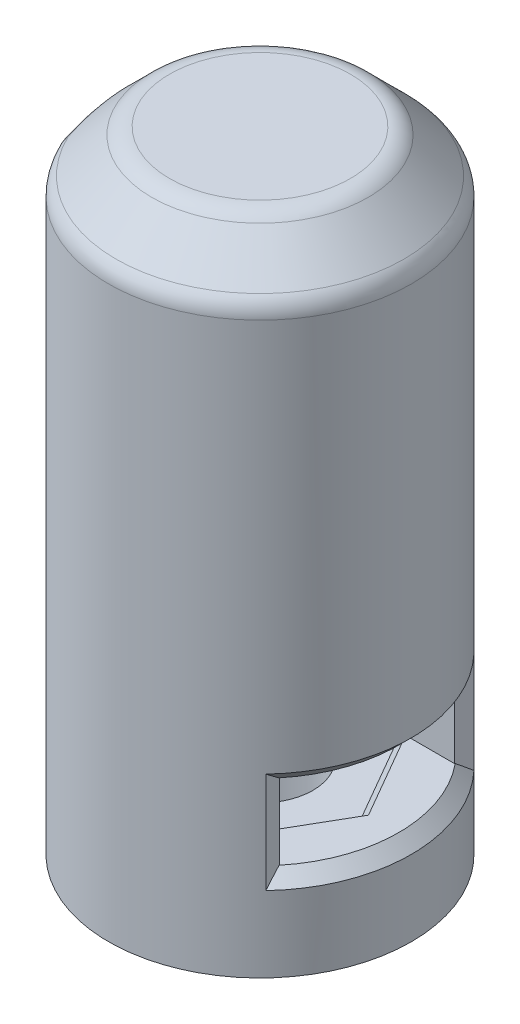
ISO-10303-21;
HEADER;
FILE_DESCRIPTION(('STEP AP214'),'2;1');
FILE_NAME('part.step','',(''),(''),'','','');
FILE_SCHEMA(('AUTOMOTIVE_DESIGN { 1 0 10303 214 1 1 1 1 }'));
ENDSEC;
DATA;
#1=APPLICATION_CONTEXT('core data for automotive mechanical design processes');
#2=APPLICATION_PROTOCOL_DEFINITION('international standard','automotive_design',2000,#1);
#3=PRODUCT_CONTEXT('',#1,'mechanical');
#4=PRODUCT('Part','Part','',(#3));
#5=PRODUCT_RELATED_PRODUCT_CATEGORY('part','',(#4));
#6=PRODUCT_DEFINITION_FORMATION('','',#4);
#7=PRODUCT_DEFINITION_CONTEXT('part definition',#1,'design');
#8=PRODUCT_DEFINITION('design','',#6,#7);
#9=PRODUCT_DEFINITION_SHAPE('','',#8);
#10=(LENGTH_UNIT() NAMED_UNIT(*) SI_UNIT(.MILLI.,.METRE.));
#11=(NAMED_UNIT(*) PLANE_ANGLE_UNIT() SI_UNIT($,.RADIAN.));
#12=(NAMED_UNIT(*) SI_UNIT($,.STERADIAN.) SOLID_ANGLE_UNIT());
#13=UNCERTAINTY_MEASURE_WITH_UNIT(LENGTH_MEASURE(1.E-05),#10,'distance_accuracy_value','');
#14=(GEOMETRIC_REPRESENTATION_CONTEXT(3) GLOBAL_UNCERTAINTY_ASSIGNED_CONTEXT((#13)) GLOBAL_UNIT_ASSIGNED_CONTEXT((#10,
#11,#12)) REPRESENTATION_CONTEXT('',''));
#15=CARTESIAN_POINT('',(0.,0.,0.));
#16=DIRECTION('',(0.,0.,1.));
#17=DIRECTION('',(1.,0.,0.));
#18=AXIS2_PLACEMENT_3D('',#15,#16,#17);
#19=CARTESIAN_POINT('',(-2.00629218543395,-9.25,3.475));
#20=DIRECTION('',(0.,0.,1.));
#21=DIRECTION('',(1.,0.,0.));
#22=AXIS2_PLACEMENT_3D('',#19,#20,#21);
#23=PLANE('',#22);
#24=DIRECTION('',(1.,0.,0.));
#25=VECTOR('',#24,1.);
#26=CARTESIAN_POINT('',(-2.00629218543395,-6.,3.475));
#27=LINE('',#26,#25);
#28=CARTESIAN_POINT('',(-2.00629218543395,-6.,3.475));
#29=VERTEX_POINT('',#28);
#30=CARTESIAN_POINT('',(4.24580486280105,-6.,3.475));
#31=VERTEX_POINT('',#30);
#32=EDGE_CURVE('E204',#29,#31,#27,.T.);
#33=ORIENTED_EDGE('',*,*,#32,.T.);
#34=DIRECTION('',(0.,-1.,0.));
#35=VECTOR('',#34,1.);
#36=CARTESIAN_POINT('',(4.24580486280105,-9.25,3.475));
#37=LINE('',#36,#35);
#38=CARTESIAN_POINT('',(4.24580486280105,-9.,3.475));
#39=VERTEX_POINT('',#38);
#40=EDGE_CURVE('E422',#31,#39,#37,.T.);
#41=ORIENTED_EDGE('',*,*,#40,.T.);
#42=DIRECTION('',(-1.,0.,0.));
#43=VECTOR('',#42,1.);
#44=CARTESIAN_POINT('',(6.,-9.,3.475));
#45=LINE('',#44,#43);
#46=CARTESIAN_POINT('',(2.29496732002876,-9.,3.475));
#47=VERTEX_POINT('',#46);
#48=EDGE_CURVE('E169',#39,#47,#45,.T.);
#49=ORIENTED_EDGE('',*,*,#48,.T.);
#50=DIRECTION('',(-0.755928946018456,-0.654653670707976,0.));
#51=VECTOR('',#50,1.);
#52=CARTESIAN_POINT('',(-0.286613169347715,-11.2357142857143,3.475));
#53=LINE('',#52,#51);
#54=CARTESIAN_POINT('',(2.00629218543395,-9.25,3.475));
#55=VERTEX_POINT('',#54);
#56=EDGE_CURVE('E162',#47,#55,#53,.T.);
#57=ORIENTED_EDGE('',*,*,#56,.T.);
#58=DIRECTION('',(1.,0.,0.));
#59=VECTOR('',#58,1.);
#60=CARTESIAN_POINT('',(-2.00629218543395,-9.25,3.475));
#61=LINE('',#60,#59);
#62=CARTESIAN_POINT('',(-2.00629218543395,-9.25,3.475));
#63=VERTEX_POINT('',#62);
#64=EDGE_CURVE('E164',#63,#55,#61,.T.);
#65=ORIENTED_EDGE('',*,*,#64,.F.);
#66=DIRECTION('',(0.,1.,0.));
#67=VECTOR('',#66,1.);
#68=CARTESIAN_POINT('',(-2.00629218543395,-9.25,3.475));
#69=LINE('',#68,#67);
#70=EDGE_CURVE('E214',#63,#29,#69,.T.);
#71=ORIENTED_EDGE('',*,*,#70,.T.);
#72=EDGE_LOOP('',(#33,#41,#49,#57,#65,#71));
#73=FACE_BOUND('',#72,.T.);
#74=ADVANCED_FACE('F41',(#73),#23,.F.);
#75=CARTESIAN_POINT('',(-4.0125843708679,-9.25,0.));
#76=DIRECTION('',(-0.866025403784438,0.,0.5));
#77=DIRECTION('',(0.5,0.,0.866025403784439));
#78=AXIS2_PLACEMENT_3D('',#75,#76,#77);
#79=PLANE('',#78);
#80=DIRECTION('',(0.5,0.,0.866025403784438));
#81=VECTOR('',#80,1.);
#82=CARTESIAN_POINT('',(-4.0125843708679,-6.,0.));
#83=LINE('',#82,#81);
#84=CARTESIAN_POINT('',(-4.0125843708679,-6.,0.));
#85=VERTEX_POINT('',#84);
#86=EDGE_CURVE('E184',#85,#29,#83,.T.);
#87=ORIENTED_EDGE('',*,*,#86,.T.);
#88=ORIENTED_EDGE('',*,*,#70,.F.);
#89=DIRECTION('',(0.5,0.,0.866025403784438));
#90=VECTOR('',#89,1.);
#91=CARTESIAN_POINT('',(-4.0125843708679,-9.25,0.));
#92=LINE('',#91,#90);
#93=CARTESIAN_POINT('',(-4.0125843708679,-9.25,0.));
#94=VERTEX_POINT('',#93);
#95=EDGE_CURVE('E183',#94,#63,#92,.T.);
#96=ORIENTED_EDGE('',*,*,#95,.F.);
#97=DIRECTION('',(0.,1.,0.));
#98=VECTOR('',#97,1.);
#99=CARTESIAN_POINT('',(-4.0125843708679,-9.25,0.));
#100=LINE('',#99,#98);
#101=EDGE_CURVE('E211',#94,#85,#100,.T.);
#102=ORIENTED_EDGE('',*,*,#101,.T.);
#103=EDGE_LOOP('',(#87,#88,#96,#102));
#104=FACE_BOUND('',#103,.T.);
#105=ADVANCED_FACE('F348',(#104),#79,.F.);
#106=CARTESIAN_POINT('',(-2.00629218543395,-9.25,-3.475));
#107=DIRECTION('',(-0.866025403784438,0.,-0.5));
#108=DIRECTION('',(-0.5,0.,0.866025403784439));
#109=AXIS2_PLACEMENT_3D('',#106,#107,#108);
#110=PLANE('',#109);
#111=DIRECTION('',(-0.5,0.,0.866025403784439));
#112=VECTOR('',#111,1.);
#113=CARTESIAN_POINT('',(-2.00629218543395,-6.,-3.475));
#114=LINE('',#113,#112);
#115=CARTESIAN_POINT('',(-2.00629218543395,-6.,-3.475));
#116=VERTEX_POINT('',#115);
#117=EDGE_CURVE('E210',#116,#85,#114,.T.);
#118=ORIENTED_EDGE('',*,*,#117,.T.);
#119=ORIENTED_EDGE('',*,*,#101,.F.);
#120=DIRECTION('',(-0.5,0.,0.866025403784439));
#121=VECTOR('',#120,1.);
#122=CARTESIAN_POINT('',(-2.00629218543395,-9.25,-3.475));
#123=LINE('',#122,#121);
#124=CARTESIAN_POINT('',(-2.00629218543395,-9.25,-3.475));
#125=VERTEX_POINT('',#124);
#126=EDGE_CURVE('E198',#125,#94,#123,.T.);
#127=ORIENTED_EDGE('',*,*,#126,.F.);
#128=DIRECTION('',(0.,1.,0.));
#129=VECTOR('',#128,1.);
#130=CARTESIAN_POINT('',(-2.00629218543395,-9.25,-3.475));
#131=LINE('',#130,#129);
#132=EDGE_CURVE('E202',#125,#116,#131,.T.);
#133=ORIENTED_EDGE('',*,*,#132,.T.);
#134=EDGE_LOOP('',(#118,#119,#127,#133));
#135=FACE_BOUND('',#134,.T.);
#136=ADVANCED_FACE('F353',(#135),#110,.F.);
#137=CARTESIAN_POINT('',(2.00629218543395,-9.25,-3.475));
#138=DIRECTION('',(0.,0.,-1.));
#139=DIRECTION('',(-1.,0.,0.));
#140=AXIS2_PLACEMENT_3D('',#137,#138,#139);
#141=PLANE('',#140);
#142=DIRECTION('',(-1.,0.,0.));
#143=VECTOR('',#142,1.);
#144=CARTESIAN_POINT('',(6.,-9.,-3.475));
#145=LINE('',#144,#143);
#146=CARTESIAN_POINT('',(4.24580486280106,-9.,-3.475));
#147=VERTEX_POINT('',#146);
#148=CARTESIAN_POINT('',(2.29496732002876,-9.,-3.475));
#149=VERTEX_POINT('',#148);
#150=EDGE_CURVE('E402',#147,#149,#145,.T.);
#151=ORIENTED_EDGE('',*,*,#150,.F.);
#152=DIRECTION('',(0.,1.,0.));
#153=VECTOR('',#152,1.);
#154=CARTESIAN_POINT('',(4.24580486280106,-9.25,-3.475));
#155=LINE('',#154,#153);
#156=CARTESIAN_POINT('',(4.24580486280106,-6.,-3.475));
#157=VERTEX_POINT('',#156);
#158=EDGE_CURVE('E412',#147,#157,#155,.T.);
#159=ORIENTED_EDGE('',*,*,#158,.T.);
#160=DIRECTION('',(-1.,0.,0.));
#161=VECTOR('',#160,1.);
#162=CARTESIAN_POINT('',(2.00629218543395,-6.,-3.475));
#163=LINE('',#162,#161);
#164=EDGE_CURVE('E205',#157,#116,#163,.T.);
#165=ORIENTED_EDGE('',*,*,#164,.T.);
#166=ORIENTED_EDGE('',*,*,#132,.F.);
#167=DIRECTION('',(-1.,0.,0.));
#168=VECTOR('',#167,1.);
#169=CARTESIAN_POINT('',(2.00629218543395,-9.25,-3.475));
#170=LINE('',#169,#168);
#171=CARTESIAN_POINT('',(2.00629218543395,-9.25,-3.475));
#172=VERTEX_POINT('',#171);
#173=EDGE_CURVE('E192',#172,#125,#170,.T.);
#174=ORIENTED_EDGE('',*,*,#173,.F.);
#175=DIRECTION('',(0.755928946018456,0.654653670707975,0.));
#176=VECTOR('',#175,1.);
#177=CARTESIAN_POINT('',(2.00629218543395,-9.25,-3.475));
#178=LINE('',#177,#176);
#179=EDGE_CURVE('E172',#172,#149,#178,.T.);
#180=ORIENTED_EDGE('',*,*,#179,.T.);
#181=EDGE_LOOP('',(#151,#159,#165,#166,#174,#180));
#182=FACE_BOUND('',#181,.T.);
#183=ADVANCED_FACE('F356',(#182),#141,.F.);
#184=CARTESIAN_POINT('',(0.,-9.25,0.));
#185=DIRECTION('',(0.,1.,0.));
#186=DIRECTION('',(0.,0.,1.));
#187=AXIS2_PLACEMENT_3D('',#184,#185,#186);
#188=PLANE('',#187);
#189=CARTESIAN_POINT('',(0.,-9.25,0.));
#190=DIRECTION('',(0.,1.,0.));
#191=DIRECTION('',(0.,0.,1.));
#192=AXIS2_PLACEMENT_3D('',#189,#190,#191);
#193=CIRCLE('',#192,2.1);
#194=CARTESIAN_POINT('',(0.,-9.25,2.1));
#195=VERTEX_POINT('',#194);
#196=EDGE_CURVE('E393',#195,#195,#193,.T.);
#197=ORIENTED_EDGE('',*,*,#196,.F.);
#198=EDGE_LOOP('',(#197));
#199=FACE_BOUND('',#198,.T.);
#200=ORIENTED_EDGE('',*,*,#64,.T.);
#201=DIRECTION('',(0.5,0.,-0.866025403784439));
#202=VECTOR('',#201,1.);
#203=CARTESIAN_POINT('',(2.00629218543395,-9.25,3.475));
#204=LINE('',#203,#202);
#205=CARTESIAN_POINT('',(4.0125843708679,-9.25,0.));
#206=VERTEX_POINT('',#205);
#207=EDGE_CURVE('E179',#55,#206,#204,.T.);
#208=ORIENTED_EDGE('',*,*,#207,.T.);
#209=DIRECTION('',(-0.5,0.,-0.866025403784438));
#210=VECTOR('',#209,1.);
#211=CARTESIAN_POINT('',(4.0125843708679,-9.25,0.));
#212=LINE('',#211,#210);
#213=EDGE_CURVE('E193',#206,#172,#212,.T.);
#214=ORIENTED_EDGE('',*,*,#213,.T.);
#215=ORIENTED_EDGE('',*,*,#173,.T.);
#216=ORIENTED_EDGE('',*,*,#126,.T.);
#217=ORIENTED_EDGE('',*,*,#95,.T.);
#218=EDGE_LOOP('',(#200,#208,#214,#215,#216,#217));
#219=FACE_BOUND('',#218,.T.);
#220=ADVANCED_FACE('F178',(#199,#219),#188,.T.);
#221=CARTESIAN_POINT('',(0.,-6.,0.));
#222=DIRECTION('',(0.,1.,0.));
#223=DIRECTION('',(0.,0.,1.));
#224=AXIS2_PLACEMENT_3D('',#221,#222,#223);
#225=PLANE('',#224);
#226=CARTESIAN_POINT('',(0.,-6.,0.));
#227=DIRECTION('',(0.,1.,0.));
#228=DIRECTION('',(0.,0.,1.));
#229=AXIS2_PLACEMENT_3D('',#226,#227,#228);
#230=CIRCLE('',#229,2.1);
#231=CARTESIAN_POINT('',(0.,-6.,2.1));
#232=VERTEX_POINT('',#231);
#233=EDGE_CURVE('E386',#232,#232,#230,.T.);
#234=ORIENTED_EDGE('',*,*,#233,.T.);
#235=EDGE_LOOP('',(#234));
#236=FACE_BOUND('',#235,.T.);
#237=ORIENTED_EDGE('',*,*,#164,.F.);
#238=DIRECTION('',(0.16690724667477,0.,-0.985972601550087));
#239=VECTOR('',#238,1.);
#240=CARTESIAN_POINT('',(3.55565835436677,-6.,0.601908354360445));
#241=LINE('',#240,#239);
#242=CARTESIAN_POINT('',(4.2487757397896,-6.,-3.49254988697016));
#243=VERTEX_POINT('',#242);
#244=EDGE_CURVE('E421',#157,#243,#241,.T.);
#245=ORIENTED_EDGE('',*,*,#244,.T.);
#246=CARTESIAN_POINT('',(0.,-6.,0.));
#247=DIRECTION('',(0.,1.,0.));
#248=DIRECTION('',(0.,0.,1.));
#249=AXIS2_PLACEMENT_3D('',#246,#247,#248);
#250=CIRCLE('',#249,5.5);
#251=CARTESIAN_POINT('',(4.2487757397899,-6.,3.4925498869698));
#252=VERTEX_POINT('',#251);
#253=EDGE_CURVE('E60',#243,#252,#250,.F.);
#254=ORIENTED_EDGE('',*,*,#253,.T.);
#255=DIRECTION('',(0.166907246674772,0.,0.985972601550087));
#256=VECTOR('',#255,1.);
#257=CARTESIAN_POINT('',(3.55565835436675,-6.,-0.60190835436045));
#258=LINE('',#257,#256);
#259=EDGE_CURVE('E11',#252,#31,#258,.F.);
#260=ORIENTED_EDGE('',*,*,#259,.T.);
#261=ORIENTED_EDGE('',*,*,#32,.F.);
#262=ORIENTED_EDGE('',*,*,#86,.F.);
#263=ORIENTED_EDGE('',*,*,#117,.F.);
#264=EDGE_LOOP('',(#237,#245,#254,#260,#261,#262,#263));
#265=FACE_BOUND('',#264,.T.);
#266=ADVANCED_FACE('F364',(#236,#265),#225,.F.);
#267=CARTESIAN_POINT('',(6.,-9.,3.475));
#268=DIRECTION('',(0.,1.,0.));
#269=DIRECTION('',(0.,0.,1.));
#270=AXIS2_PLACEMENT_3D('',#267,#268,#269);
#271=PLANE('',#270);
#272=ORIENTED_EDGE('',*,*,#48,.F.);
#273=DIRECTION('',(-0.166907246674772,0.,-0.985972601550087));
#274=VECTOR('',#273,1.);
#275=CARTESIAN_POINT('',(4.24580486280105,-9.,3.475));
#276=LINE('',#275,#274);
#277=CARTESIAN_POINT('',(4.2487757397899,-9.,3.4925498869698));
#278=VERTEX_POINT('',#277);
#279=EDGE_CURVE('E434',#39,#278,#276,.F.);
#280=ORIENTED_EDGE('',*,*,#279,.T.);
#281=CARTESIAN_POINT('',(0.,-9.,0.));
#282=DIRECTION('',(0.,1.,0.));
#283=DIRECTION('',(0.,0.,1.));
#284=AXIS2_PLACEMENT_3D('',#281,#282,#283);
#285=CIRCLE('',#284,5.5);
#286=CARTESIAN_POINT('',(4.24877573978991,-9.,-3.49254988696979));
#287=VERTEX_POINT('',#286);
#288=EDGE_CURVE('E61',#278,#287,#285,.T.);
#289=ORIENTED_EDGE('',*,*,#288,.T.);
#290=DIRECTION('',(-0.16690724667477,0.,0.985972601550087));
#291=VECTOR('',#290,1.);
#292=CARTESIAN_POINT('',(4.24580486280106,-9.,-3.475));
#293=LINE('',#292,#291);
#294=EDGE_CURVE('E321',#287,#147,#293,.T.);
#295=ORIENTED_EDGE('',*,*,#294,.T.);
#296=ORIENTED_EDGE('',*,*,#150,.T.);
#297=DIRECTION('',(0.5,0.,0.866025403784439));
#298=VECTOR('',#297,1.);
#299=CARTESIAN_POINT('',(4.22909072181401,-9.,-0.125000000000003));
#300=LINE('',#299,#298);
#301=CARTESIAN_POINT('',(4.30125950546271,-9.,0.));
#302=VERTEX_POINT('',#301);
#303=EDGE_CURVE('E274',#149,#302,#300,.T.);
#304=ORIENTED_EDGE('',*,*,#303,.T.);
#305=DIRECTION('',(-0.5,0.,0.866025403784439));
#306=VECTOR('',#305,1.);
#307=CARTESIAN_POINT('',(2.22279853638006,-9.,3.6));
#308=LINE('',#307,#306);
#309=EDGE_CURVE('E174',#302,#47,#308,.T.);
#310=ORIENTED_EDGE('',*,*,#309,.T.);
#311=EDGE_LOOP('',(#272,#280,#289,#295,#296,#304,#310));
#312=FACE_BOUND('',#311,.T.);
#313=ADVANCED_FACE('F370',(#312),#271,.T.);
#314=CARTESIAN_POINT('',(0.,12.5,0.));
#315=DIRECTION('',(0.,-1.,0.));
#316=DIRECTION('',(0.,0.,-1.));
#317=AXIS2_PLACEMENT_3D('',#314,#315,#316);
#318=CYLINDRICAL_SURFACE('',#317,6.);
#319=CARTESIAN_POINT('',(0.,10.0857864376269,0.));
#320=DIRECTION('',(0.,1.,0.));
#321=DIRECTION('',(0.,0.,1.));
#322=AXIS2_PLACEMENT_3D('',#319,#320,#321);
#323=CIRCLE('',#322,6.);
#324=CARTESIAN_POINT('',(-5.4,10.0857864376269,-2.6153393661244));
#325=VERTEX_POINT('',#324);
#326=CARTESIAN_POINT('',(-5.4,10.0857864376269,2.6153393661244));
#327=VERTEX_POINT('',#326);
#328=EDGE_CURVE('E484',#325,#327,#323,.F.);
#329=ORIENTED_EDGE('',*,*,#328,.T.);
#330=DIRECTION('',(0.,-1.,0.));
#331=VECTOR('',#330,1.);
#332=CARTESIAN_POINT('',(-5.4,12.5,2.6153393661244));
#333=LINE('',#332,#331);
#334=CARTESIAN_POINT('',(-5.4,-12.5,2.6153393661244));
#335=VERTEX_POINT('',#334);
#336=EDGE_CURVE('E486',#327,#335,#333,.T.);
#337=ORIENTED_EDGE('',*,*,#336,.T.);
#338=CARTESIAN_POINT('',(0.,-12.5,0.));
#339=DIRECTION('',(0.,1.,0.));
#340=DIRECTION('',(0.,0.,1.));
#341=AXIS2_PLACEMENT_3D('',#338,#339,#340);
#342=CIRCLE('',#341,6.);
#343=CARTESIAN_POINT('',(-5.4,-12.5,-2.6153393661244));
#344=VERTEX_POINT('',#343);
#345=EDGE_CURVE('E222',#335,#344,#342,.T.);
#346=ORIENTED_EDGE('',*,*,#345,.T.);
#347=DIRECTION('',(0.,-1.,0.));
#348=VECTOR('',#347,1.);
#349=CARTESIAN_POINT('',(-5.4,12.5,-2.6153393661244));
#350=LINE('',#349,#348);
#351=EDGE_CURVE('E479',#344,#325,#350,.F.);
#352=ORIENTED_EDGE('',*,*,#351,.T.);
#353=EDGE_LOOP('',(#329,#337,#346,#352));
#354=FACE_BOUND('',#353,.T.);
#355=CARTESIAN_POINT('',(0.,-5.5,0.));
#356=DIRECTION('',(0.,1.,0.));
#357=DIRECTION('',(0.,0.,1.));
#358=AXIS2_PLACEMENT_3D('',#355,#356,#357);
#359=CIRCLE('',#358,6.);
#360=CARTESIAN_POINT('',(4.3560303782925,-5.5,4.12613612758872));
#361=VERTEX_POINT('',#360);
#362=CARTESIAN_POINT('',(4.35603037829251,-5.5,-4.12613612758872));
#363=VERTEX_POINT('',#362);
#364=EDGE_CURVE('E407',#361,#363,#359,.T.);
#365=ORIENTED_EDGE('',*,*,#364,.T.);
#366=DIRECTION('',(0.,-1.,0.));
#367=VECTOR('',#366,1.);
#368=CARTESIAN_POINT('',(4.35603037829251,12.5,-4.12613612758872));
#369=LINE('',#368,#367);
#370=CARTESIAN_POINT('',(4.35603037829251,-9.5,-4.12613612758872));
#371=VERTEX_POINT('',#370);
#372=EDGE_CURVE('E418',#363,#371,#369,.T.);
#373=ORIENTED_EDGE('',*,*,#372,.T.);
#374=CARTESIAN_POINT('',(0.,-9.5,0.));
#375=DIRECTION('',(0.,1.,0.));
#376=DIRECTION('',(0.,0.,1.));
#377=AXIS2_PLACEMENT_3D('',#374,#375,#376);
#378=CIRCLE('',#377,6.);
#379=CARTESIAN_POINT('',(4.3560303782925,-9.5,4.12613612758872));
#380=VERTEX_POINT('',#379);
#381=EDGE_CURVE('E406',#371,#380,#378,.F.);
#382=ORIENTED_EDGE('',*,*,#381,.T.);
#383=DIRECTION('',(0.,-1.,0.));
#384=VECTOR('',#383,1.);
#385=CARTESIAN_POINT('',(4.3560303782925,12.5,4.12613612758872));
#386=LINE('',#385,#384);
#387=EDGE_CURVE('E416',#380,#361,#386,.F.);
#388=ORIENTED_EDGE('',*,*,#387,.T.);
#389=EDGE_LOOP('',(#365,#373,#382,#388));
#390=FACE_BOUND('',#389,.T.);
#391=ADVANCED_FACE('F372',(#354,#390),#318,.T.);
#392=CARTESIAN_POINT('',(0.,-12.5,0.));
#393=DIRECTION('',(0.,1.,0.));
#394=DIRECTION('',(0.,0.,1.));
#395=AXIS2_PLACEMENT_3D('',#392,#393,#394);
#396=PLANE('',#395);
#397=CARTESIAN_POINT('',(0.,-12.5,0.));
#398=DIRECTION('',(0.,-1.,0.));
#399=DIRECTION('',(0.,0.,-1.));
#400=AXIS2_PLACEMENT_3D('',#397,#398,#399);
#401=CIRCLE('',#400,2.1);
#402=CARTESIAN_POINT('',(0.,-12.5,-2.1));
#403=VERTEX_POINT('',#402);
#404=EDGE_CURVE('E391',#403,#403,#401,.T.);
#405=ORIENTED_EDGE('',*,*,#404,.F.);
#406=EDGE_LOOP('',(#405));
#407=FACE_BOUND('',#406,.T.);
#408=ORIENTED_EDGE('',*,*,#345,.F.);
#409=CARTESIAN_POINT('',(-4.5,-12.5,2.17944947177034));
#410=DIRECTION('',(0.,1.,0.));
#411=DIRECTION('',(0.,0.,1.));
#412=AXIS2_PLACEMENT_3D('',#409,#410,#411);
#413=CIRCLE('',#412,1.);
#414=CARTESIAN_POINT('',(-5.5,-12.5,2.17944947177034));
#415=VERTEX_POINT('',#414);
#416=EDGE_CURVE('E442',#335,#415,#413,.F.);
#417=ORIENTED_EDGE('',*,*,#416,.T.);
#418=DIRECTION('',(0.,0.,-1.));
#419=VECTOR('',#418,1.);
#420=CARTESIAN_POINT('',(-5.5,-12.5,6.));
#421=LINE('',#420,#419);
#422=CARTESIAN_POINT('',(-5.5,-12.5,-2.17944947177034));
#423=VERTEX_POINT('',#422);
#424=EDGE_CURVE('E218',#415,#423,#421,.T.);
#425=ORIENTED_EDGE('',*,*,#424,.T.);
#426=CARTESIAN_POINT('',(-4.5,-12.5,-2.17944947177034));
#427=DIRECTION('',(0.,1.,0.));
#428=DIRECTION('',(0.,0.,1.));
#429=AXIS2_PLACEMENT_3D('',#426,#427,#428);
#430=CIRCLE('',#429,1.);
#431=EDGE_CURVE('E443',#423,#344,#430,.F.);
#432=ORIENTED_EDGE('',*,*,#431,.T.);
#433=EDGE_LOOP('',(#408,#417,#425,#432));
#434=FACE_BOUND('',#433,.T.);
#435=ADVANCED_FACE('F510',(#407,#434),#396,.F.);
#436=CARTESIAN_POINT('',(0.,12.5,0.));
#437=DIRECTION('',(0.,-1.,0.));
#438=DIRECTION('',(0.,0.,-1.));
#439=AXIS2_PLACEMENT_3D('',#436,#437,#438);
#440=CONICAL_SURFACE('',#439,4.,0.785398163397447);
#441=CARTESIAN_POINT('',(0.,12.2071067811865,0.));
#442=DIRECTION('',(0.,1.,0.));
#443=DIRECTION('',(0.,0.,1.));
#444=AXIS2_PLACEMENT_3D('',#441,#442,#443);
#445=CIRCLE('',#444,4.29289321881345);
#446=CARTESIAN_POINT('',(0.,12.2071067811865,4.29289321881345));
#447=VERTEX_POINT('',#446);
#448=EDGE_CURVE('E477',#447,#447,#445,.F.);
#449=ORIENTED_EDGE('',*,*,#448,.T.);
#450=EDGE_LOOP('',(#449));
#451=FACE_BOUND('',#450,.T.);
#452=CARTESIAN_POINT('',(-5.5,9.65391433602277,-3.04224169457085));
#453=CARTESIAN_POINT('',(-5.5,10.0998139547401,-3.29197776830028));
#454=CARTESIAN_POINT('',(-5.08579812923058,10.3610211172093,-3.43827269309237));
#455=CARTESIAN_POINT('',(-5.5,9.73894676878001,-2.89027819813753));
#456=CARTESIAN_POINT('',(-5.5,10.1820011143263,-3.13052557273965));
#457=CARTESIAN_POINT('',(-5.09494772586447,10.446053549691,-3.27274399772564));
#458=CARTESIAN_POINT('',(-5.5,9.82082182076235,-2.73640926389293));
#459=CARTESIAN_POINT('',(-5.5,10.2613611642043,-2.96607219022875));
#460=CARTESIAN_POINT('',(-5.10422800163639,10.5279286016596,-3.10416134576719));
#461=CARTESIAN_POINT('',(-5.5,9.9763198379386,-2.42390321458375));
#462=CARTESIAN_POINT('',(-5.5,10.4118789495271,-2.63118563912123));
#463=CARTESIAN_POINT('',(-5.12262694429102,10.68342661896,-2.7595905377516));
#464=CARTESIAN_POINT('',(-5.5,10.049912793439,-2.26525124377999));
#465=CARTESIAN_POINT('',(-5.5,10.4830693778881,-2.46073276505061));
#466=CARTESIAN_POINT('',(-5.13174492866355,10.7570195745989,-2.58357843984478));
#467=CARTESIAN_POINT('',(-5.5,10.1872139045676,-1.94108003560294));
#468=CARTESIAN_POINT('',(-5.5,10.6157118511374,-2.11152411997425));
#469=CARTESIAN_POINT('',(-5.14944594443751,10.8943206857812,-2.22154324076246));
#470=CARTESIAN_POINT('',(-5.5,10.2507729355536,-1.77549651732739));
#471=CARTESIAN_POINT('',(-5.5,10.6771108702211,-1.93262719970983));
#472=CARTESIAN_POINT('',(-5.1580199428673,10.9578797166794,-2.03541607242752));
#473=CARTESIAN_POINT('',(-5.5,10.3637121525901,-1.43976817530307));
#474=CARTESIAN_POINT('',(-5.5,10.7860411110021,-1.56909731836464));
#475=CARTESIAN_POINT('',(-5.17375835016512,11.0708189338051,-1.65562859084227));
#476=CARTESIAN_POINT('',(-5.5,10.4131133652421,-1.26963053041049));
#477=CARTESIAN_POINT('',(-5.5,10.8337043720782,-1.38434520294174));
#478=CARTESIAN_POINT('',(-5.18092484436551,11.1202201466337,-1.46197993903727));
#479=CARTESIAN_POINT('',(-5.5,10.4996603393735,-0.904249316015233));
#480=CARTESIAN_POINT('',(-5.5,10.9170412033141,-0.987078192890237));
#481=CARTESIAN_POINT('',(-5.19375850933283,11.2067671203301,-1.04394546263259));
#482=CARTESIAN_POINT('',(-5.5,10.5345920198551,-0.708464164512085));
#483=CARTESIAN_POINT('',(-5.5,10.9507278510603,-0.773507378139015));
#484=CARTESIAN_POINT('',(-5.19913828368979,11.2416988001019,-0.818680921167114));
#485=CARTESIAN_POINT('',(-5.5,10.5789415355228,-0.31529365308487));
#486=CARTESIAN_POINT('',(-5.5,10.9933943236307,-0.344563139153054));
#487=CARTESIAN_POINT('',(-5.20601372918199,11.2860483157898,-0.364914131651586));
#488=CARTESIAN_POINT('',(-5.5,10.5885364946212,-0.117929129510151));
#489=CARTESIAN_POINT('',(-5.5,11.0026420120075,-0.128742747703025));
#490=CARTESIAN_POINT('',(-5.20753636175311,11.295643275608,-0.13644564648279));
#491=CARTESIAN_POINT('',(-5.5,10.5826767670154,0.217184785661757));
#492=CARTESIAN_POINT('',(-5.5,10.9970105022581,0.237186411181802));
#493=CARTESIAN_POINT('',(-5.20661995813136,11.2897835483418,0.251298825161102));
#494=CARTESIAN_POINT('',(-5.5,10.573863140684,0.355087200007476));
#495=CARTESIAN_POINT('',(-5.5,10.9885222310971,0.387847671020611));
#496=CARTESIAN_POINT('',(-5.20523076036205,11.2809699218951,0.410806521953907));
#497=CARTESIAN_POINT('',(-5.5,10.544002964933,0.629598667287719));
#498=CARTESIAN_POINT('',(-5.5,10.9597920023337,0.687364191554096));
#499=CARTESIAN_POINT('',(-5.2005936587785,11.2511097460852,0.727689949475459));
#500=CARTESIAN_POINT('',(-5.5,10.5229525763874,0.76620730063913));
#501=CARTESIAN_POINT('',(-5.5,10.9395145836227,0.836380418006595));
#502=CARTESIAN_POINT('',(-5.19734517164119,11.2300593575961,0.885064995248702));
#503=CARTESIAN_POINT('',(-5.5,10.4693801453045,1.03891135665543));
#504=CARTESIAN_POINT('',(-5.5,10.8879387914247,1.13333351077959));
#505=CARTESIAN_POINT('',(-5.18925349179835,11.1764869264686,1.19816200716017));
#506=CARTESIAN_POINT('',(-5.5,10.4367169732352,1.17497865066879));
#507=CARTESIAN_POINT('',(-5.5,10.8564549150257,1.28136189599719));
#508=CARTESIAN_POINT('',(-5.1843907313979,11.1438237542963,1.35383819626727));
#509=CARTESIAN_POINT('',(-5.5,10.3614665214653,1.44426331880029));
#510=CARTESIAN_POINT('',(-5.5,10.7839365276701,1.57372900505041));
#511=CARTESIAN_POINT('',(-5.17348757102967,11.0685733025118,1.66058286598294));
#512=CARTESIAN_POINT('',(-5.5,10.3188811664497,1.57748124016927));
#513=CARTESIAN_POINT('',(-5.5,10.7428466135875,1.71816185129603));
#514=CARTESIAN_POINT('',(-5.16744739949081,11.0259879475847,1.8116522337946));
#515=CARTESIAN_POINT('',(-5.5,10.1628238386466,2.01708932920722));
#516=CARTESIAN_POINT('',(-5.5,10.5919087634272,2.19488264867359));
#517=CARTESIAN_POINT('',(-5.1460322292732,10.8699306199536,2.30767434423228));
#518=CARTESIAN_POINT('',(-5.5,10.0306961169011,2.31689415898754));
#519=CARTESIAN_POINT('',(-5.5,10.4639920464551,2.51777760738421));
#520=CARTESIAN_POINT('',(-5.12897306041994,10.7378028981269,2.64182472835836));
#521=CARTESIAN_POINT('',(-5.5,9.81062694393553,2.75559169169862));
#522=CARTESIAN_POINT('',(-5.5,10.2515072287646,2.98652398111439));
#523=CARTESIAN_POINT('',(-5.10307427451871,10.5177337251024,3.12518106318752));
#524=CARTESIAN_POINT('',(-5.5,9.73344562342974,2.9002710507065));
#525=CARTESIAN_POINT('',(-5.5,10.1767206627006,3.14107983342983));
#526=CARTESIAN_POINT('',(-5.09437173064337,10.4405524045875,3.28362430908386));
#527=CARTESIAN_POINT('',(-5.5,9.57319235000236,3.18633805581306));
#528=CARTESIAN_POINT('',(-5.5,10.0213294186397,3.44597181300638));
#529=CARTESIAN_POINT('',(-5.07709613113613,10.2802991311727,3.59523668199022));
#530=CARTESIAN_POINT('',(-5.5,9.49012148239173,3.32772630204386));
#531=CARTESIAN_POINT('',(-5.5,9.94069663288353,3.59628035844991));
#532=CARTESIAN_POINT('',(-5.06852305199817,10.1972282635839,3.74840677303538));
#533=CARTESIAN_POINT('',(-5.5,9.32300628229713,3.60150882571086));
#534=CARTESIAN_POINT('',(-5.5,9.77838428295442,3.88666129640918));
#535=CARTESIAN_POINT('',(-5.05204590511672,10.0301130634783,4.0435714138817));
#536=CARTESIAN_POINT('',(-5.5,9.23916196859385,3.73402660406274));
#537=CARTESIAN_POINT('',(-5.5,9.69687348676796,4.02688890469521));
#538=CARTESIAN_POINT('',(-5.04412896233218,9.94626874974469,4.18576213673011));
#539=CARTESIAN_POINT('',(-5.5,9.06795251940193,3.99678013422465));
#540=CARTESIAN_POINT('',(-5.5,9.53030044239037,4.30439524295561));
#541=CARTESIAN_POINT('',(-5.02864837358347,9.77505930056769,4.46653729678131));
#542=CARTESIAN_POINT('',(-5.5,8.98058710423897,4.12701570357976));
#543=CARTESIAN_POINT('',(-5.5,9.4452360877232,4.44163188127636));
#544=CARTESIAN_POINT('',(-5.02108475578665,9.68769388545001,4.60512144607646));
#545=CARTESIAN_POINT('',(-5.5,8.80370692744182,4.38442820890089));
#546=CARTESIAN_POINT('',(-5.5,9.27288566332554,4.7123989158119));
#547=CARTESIAN_POINT('',(-5.00641467937292,9.51081370860408,4.87804511753769));
#548=CARTESIAN_POINT('',(-5.5,8.71421591480751,4.51162153225726));
#549=CARTESIAN_POINT('',(-5.5,9.18562552595297,4.84591337307089));
#550=CARTESIAN_POINT('',(-4.99930495746463,9.42132269587685,5.01241026390862));
#551=CARTESIAN_POINT('',(-5.5,8.53287994203762,4.76426690285388));
#552=CARTESIAN_POINT('',(-5.5,9.00867353247677,5.1106890056495));
#553=CARTESIAN_POINT('',(-4.9854870802566,9.23998672302624,5.27845829058956));
#554=CARTESIAN_POINT('',(-5.5,8.44103564965177,4.88971942881057));
#555=CARTESIAN_POINT('',(-5.5,8.91899176312607,5.2419093554507));
#556=CARTESIAN_POINT('',(-4.97877881280633,9.14814243065255,5.41014191316553));
#557=CARTESIAN_POINT('',(-5.5,8.34823055990727,5.01444505457924));
#558=CARTESIAN_POINT('',(-5.5,8.82851222439034,5.3718960443716));
#559=CARTESIAN_POINT('',(-4.97227519490591,9.05533734109382,5.5407112802451));
#560=(BOUNDED_SURFACE() B_SPLINE_SURFACE(3,2,((#452,#453,#454),(#455,#456,#457),(#458,#459,
#460),(#461,#462,#463),(#464,#465,#466),(#467,#468,#469),(#470,#471,#472),(#473,#474,#475),
(#476,#477,#478),(#479,#480,#481),(#482,#483,#484),(#485,#486,#487),(#488,#489,#490),(#491,#492,
#493),(#494,#495,#496),(#497,#498,#499),(#500,#501,#502),(#503,#504,#505),(#506,#507,#508),
(#509,#510,#511),(#512,#513,#514),(#515,#516,#517),(#518,#519,#520),(#521,#522,#523),(#524,#525,
#526),(#527,#528,#529),(#530,#531,#532),(#533,#534,#535),(#536,#537,#538),(#539,#540,#541),
(#542,#543,#544),(#545,#546,#547),(#548,#549,#550),(#551,#552,#553),(#554,#555,#556),(#557,#558,
#559)),.UNSPECIFIED.,.F.,.F.,.F.) B_SPLINE_SURFACE_WITH_KNOTS((4,2,2,2,2,2,2,2,2,2,2,2,2,2,2,2,
2,4),(3,3),(0.,0.522551292816922,1.04693888127082,1.57850574242304,2.10927900228754,
2.70444864770014,3.29544642971661,3.7094599196629,4.12360337114289,4.54296232946899,
4.96224000900771,5.94204706000645,6.43394730410813,6.92575713650125,7.39614433922858,
7.86656897782504,8.33310337081877,8.79950681819626),(0.,1.),
.UNSPECIFIED.) GEOMETRIC_REPRESENTATION_ITEM() RATIONAL_B_SPLINE_SURFACE(((1.,0.890448799547334,
1.),(1.,0.893018348885863,1.),(1.,0.895612010201255,1.),(1.,0.90073287428489,1.),(1.,
0.903259811482592,1.),(1.,0.908145961939019,1.),(1.,0.910502405284601,1.),(1.,0.914813538076567,
1.),(1.,0.916768822068078,1.),(1.,0.920262317695867,1.),(1.,0.921721146188964,1.),(1.,
0.923584252039475,1.),(1.,0.923995849634141,1.),(1.,0.923747746875971,1.),(1.,0.923371952577218,
1.),(1.,0.922115630463574,1.),(1.,0.921234944246572,1.),(1.,0.919036411433471,1.),(1.,
0.91771319914039,1.),(1.,0.914738247053544,1.),(1.,0.913086570983617,1.),(1.,0.907211317792287,
1.),(1.,0.90250139644097,1.),(1.,0.895289537393422,1.),(1.,0.892856009145611,1.),(1.,
0.8880055413,1.),(1.,0.885588598735401,1.),(1.,0.880924623453611,1.),(1.,0.878674775498034,1.),
(1.,0.87425914680412,1.),(1.,0.872093372770542,1.),(1.,0.867877729101857,1.),(1.,
0.865827049089228,1.),(1.,0.861828020055522,1.),(1.,0.859879642474011,1.),(1.,0.857984613762364,1.))) REPRESENTATION_ITEM('') SURFACE());
#561=CARTESIAN_POINT('',(-5.08579812923058,10.3610211172093,-3.43827269309237));
#562=CARTESIAN_POINT('',(-5.09494772586447,10.446053549691,-3.27274399772564));
#563=CARTESIAN_POINT('',(-5.10422800163639,10.5279286016596,-3.10416134576719));
#564=CARTESIAN_POINT('',(-5.12262694429102,10.68342661896,-2.7595905377516));
#565=CARTESIAN_POINT('',(-5.13174492866355,10.7570195745989,-2.58357843984478));
#566=CARTESIAN_POINT('',(-5.14944594443751,10.8943206857812,-2.22154324076246));
#567=CARTESIAN_POINT('',(-5.1580199428673,10.9578797166794,-2.03541607242752));
#568=CARTESIAN_POINT('',(-5.17375835016512,11.0708189338051,-1.65562859084227));
#569=CARTESIAN_POINT('',(-5.18092484436551,11.1202201466337,-1.46197993903727));
#570=CARTESIAN_POINT('',(-5.19375850933283,11.2067671203301,-1.04394546263259));
#571=CARTESIAN_POINT('',(-5.19913828368979,11.2416988001019,-0.818680921167114));
#572=CARTESIAN_POINT('',(-5.20601372918199,11.2860483157898,-0.364914131651586));
#573=CARTESIAN_POINT('',(-5.20753636175311,11.295643275608,-0.13644564648279));
#574=CARTESIAN_POINT('',(-5.20661995813136,11.2897835483418,0.251298825161102));
#575=CARTESIAN_POINT('',(-5.20523076036205,11.2809699218951,0.410806521953907));
#576=CARTESIAN_POINT('',(-5.2005936587785,11.2511097460852,0.727689949475459));
#577=CARTESIAN_POINT('',(-5.19734517164119,11.2300593575961,0.885064995248702));
#578=CARTESIAN_POINT('',(-5.18925349179835,11.1764869264686,1.19816200716017));
#579=CARTESIAN_POINT('',(-5.1843907313979,11.1438237542963,1.35383819626727));
#580=CARTESIAN_POINT('',(-5.17348757102967,11.0685733025118,1.66058286598294));
#581=CARTESIAN_POINT('',(-5.16744739949081,11.0259879475847,1.8116522337946));
#582=CARTESIAN_POINT('',(-5.1460322292732,10.8699306199536,2.30767434423228));
#583=CARTESIAN_POINT('',(-5.12897306041994,10.7378028981269,2.64182472835836));
#584=CARTESIAN_POINT('',(-5.10307427451871,10.5177337251024,3.12518106318752));
#585=CARTESIAN_POINT('',(-5.09437173064337,10.4405524045875,3.28362430908386));
#586=CARTESIAN_POINT('',(-5.07709613113613,10.2802991311727,3.59523668199022));
#587=CARTESIAN_POINT('',(-5.06852305199817,10.1972282635839,3.74840677303538));
#588=CARTESIAN_POINT('',(-5.05204590511672,10.0301130634783,4.0435714138817));
#589=CARTESIAN_POINT('',(-5.04412896233218,9.94626874974469,4.18576213673011));
#590=CARTESIAN_POINT('',(-5.02864837358347,9.77505930056769,4.46653729678131));
#591=CARTESIAN_POINT('',(-5.02108475578665,9.68769388545001,4.60512144607646));
#592=CARTESIAN_POINT('',(-5.00641467937292,9.51081370860408,4.87804511753769));
#593=CARTESIAN_POINT('',(-4.99930495746463,9.42132269587685,5.01241026390862));
#594=CARTESIAN_POINT('',(-4.9854870802566,9.23998672302624,5.27845829058956));
#595=CARTESIAN_POINT('',(-4.97877881280633,9.14814243065256,5.41014191316553));
#596=CARTESIAN_POINT('',(-4.97227519490591,9.05533734109382,5.5407112802451));
#597=B_SPLINE_CURVE_WITH_KNOTS('',3,(#561,#562,#563,#564,#565,#566,#567,#568,#569,#570,#571,
#572,#573,#574,#575,#576,#577,#578,#579,#580,#581,#582,#583,#584,#585,#586,#587,#588,#589,#590,
#591,#592,#593,#594,#595,#596),.UNSPECIFIED.,.F.,.F.,(4,2,2,2,2,2,2,2,2,2,2,2,2,2,2,2,2,4),(0.,
0.522551292816922,1.04693888127082,1.57850574242304,2.10927900228754,2.70444864770014,
3.29544642971661,3.7094599196629,4.12360337114289,4.54296232946899,4.96224000900771,
5.94204706000645,6.43394730410813,6.92575713650125,7.39614433922858,7.86656897782504,
8.33310337081877,8.79950681819626),.UNSPECIFIED.);
#598=CARTESIAN_POINT('',(-5.1363961030679,10.7928932188135,-2.48767017191864));
#599=VERTEX_POINT('',#598);
#600=CARTESIAN_POINT('',(-5.13639610306789,10.7928932188134,2.48767017191879));
#601=VERTEX_POINT('',#600);
#602=EDGE_CURVE('E230',#599,#601,#597,.T.);
#603=ORIENTED_EDGE('',*,*,#602,.T.);
#604=CARTESIAN_POINT('',(0.,10.7928932188134,0.));
#605=DIRECTION('',(0.,-1.,0.));
#606=DIRECTION('',(0.,0.,-1.));
#607=AXIS2_PLACEMENT_3D('',#604,#605,#606);
#608=CIRCLE('',#607,5.70710678118655);
#609=EDGE_CURVE('E240',#601,#599,#608,.F.);
#610=ORIENTED_EDGE('',*,*,#609,.T.);
#611=EDGE_LOOP('',(#603,#610));
#612=FACE_BOUND('',#611,.T.);
#613=ADVANCED_FACE('F239',(#451,#612),#440,.T.);
#614=CARTESIAN_POINT('',(0.,12.5,0.));
#615=DIRECTION('',(0.,1.,0.));
#616=DIRECTION('',(0.,0.,1.));
#617=AXIS2_PLACEMENT_3D('',#614,#615,#616);
#618=PLANE('',#617);
#619=CARTESIAN_POINT('',(0.,12.5,0.));
#620=DIRECTION('',(0.,1.,0.));
#621=DIRECTION('',(0.,0.,1.));
#622=AXIS2_PLACEMENT_3D('',#619,#620,#621);
#623=CIRCLE('',#622,3.5857864376269);
#624=CARTESIAN_POINT('',(0.,12.5,3.5857864376269));
#625=VERTEX_POINT('',#624);
#626=EDGE_CURVE('E228',#625,#625,#623,.T.);
#627=ORIENTED_EDGE('',*,*,#626,.T.);
#628=EDGE_LOOP('',(#627));
#629=FACE_BOUND('',#628,.T.);
#630=ADVANCED_FACE('F511',(#629),#618,.T.);
#631=CARTESIAN_POINT('',(-5.5,0.,0.));
#632=DIRECTION('',(-1.,0.,0.));
#633=DIRECTION('',(0.,0.,1.));
#634=AXIS2_PLACEMENT_3D('',#631,#632,#633);
#635=PLANE('',#634);
#636=ORIENTED_EDGE('',*,*,#424,.F.);
#637=DIRECTION('',(0.,1.,0.));
#638=VECTOR('',#637,1.);
#639=CARTESIAN_POINT('',(-5.5,10.5,2.17944947177034));
#640=LINE('',#639,#638);
#641=CARTESIAN_POINT('',(-5.5,10.0857864376269,2.17944947177034));
#642=VERTEX_POINT('',#641);
#643=EDGE_CURVE('E448',#415,#642,#640,.T.);
#644=ORIENTED_EDGE('',*,*,#643,.T.);
#645=CARTESIAN_POINT('',(-5.5,8.34823055990727,5.01444505457924));
#646=CARTESIAN_POINT('',(-5.5,8.44103564965178,4.88971942881057));
#647=CARTESIAN_POINT('',(-5.5,8.53287994203762,4.76426690285388));
#648=CARTESIAN_POINT('',(-5.5,8.71421591480751,4.51162153225726));
#649=CARTESIAN_POINT('',(-5.5,8.80370692744182,4.38442820890089));
#650=CARTESIAN_POINT('',(-5.5,8.98058710423897,4.12701570357976));
#651=CARTESIAN_POINT('',(-5.5,9.06795251940193,3.99678013422466));
#652=CARTESIAN_POINT('',(-5.5,9.23916196859385,3.73402660406274));
#653=CARTESIAN_POINT('',(-5.5,9.32300628229713,3.60150882571086));
#654=CARTESIAN_POINT('',(-5.5,9.49012148239173,3.32772630204386));
#655=CARTESIAN_POINT('',(-5.5,9.57319235000236,3.18633805581306));
#656=CARTESIAN_POINT('',(-5.5,9.73344562342974,2.9002710507065));
#657=CARTESIAN_POINT('',(-5.5,9.81062694393553,2.75559169169862));
#658=CARTESIAN_POINT('',(-5.5,10.0306961169011,2.31689415898754));
#659=CARTESIAN_POINT('',(-5.5,10.1628238386466,2.01708932920722));
#660=CARTESIAN_POINT('',(-5.5,10.3188811664497,1.57748124016927));
#661=CARTESIAN_POINT('',(-5.5,10.3614665214653,1.44426331880029));
#662=CARTESIAN_POINT('',(-5.5,10.4367169732352,1.17497865066879));
#663=CARTESIAN_POINT('',(-5.5,10.4693801453045,1.03891135665543));
#664=CARTESIAN_POINT('',(-5.5,10.5229525763874,0.76620730063913));
#665=CARTESIAN_POINT('',(-5.5,10.544002964933,0.629598667287719));
#666=CARTESIAN_POINT('',(-5.5,10.573863140684,0.355087200007476));
#667=CARTESIAN_POINT('',(-5.5,10.5826767670154,0.217184785661757));
#668=CARTESIAN_POINT('',(-5.5,10.5885364946212,-0.117929129510151));
#669=CARTESIAN_POINT('',(-5.5,10.5789415355228,-0.31529365308487));
#670=CARTESIAN_POINT('',(-5.5,10.5345920198551,-0.708464164512085));
#671=CARTESIAN_POINT('',(-5.5,10.4996603393735,-0.904249316015233));
#672=CARTESIAN_POINT('',(-5.5,10.4131133652421,-1.26963053041049));
#673=CARTESIAN_POINT('',(-5.5,10.3637121525901,-1.43976817530307));
#674=CARTESIAN_POINT('',(-5.5,10.2507729355536,-1.77549651732739));
#675=CARTESIAN_POINT('',(-5.5,10.1872139045676,-1.94108003560294));
#676=CARTESIAN_POINT('',(-5.5,10.049912793439,-2.26525124377999));
#677=CARTESIAN_POINT('',(-5.5,9.9763198379386,-2.42390321458375));
#678=CARTESIAN_POINT('',(-5.5,9.82082182076235,-2.73640926389293));
#679=CARTESIAN_POINT('',(-5.5,9.73894676878001,-2.89027819813753));
#680=CARTESIAN_POINT('',(-5.5,9.65391433602277,-3.04224169457085));
#681=B_SPLINE_CURVE_WITH_KNOTS('',3,(#645,#646,#647,#648,#649,#650,#651,#652,#653,#654,#655,
#656,#657,#658,#659,#660,#661,#662,#663,#664,#665,#666,#667,#668,#669,#670,#671,#672,#673,#674,
#675,#676,#677,#678,#679,#680),.UNSPECIFIED.,.F.,.F.,(4,2,2,2,2,2,2,2,2,2,2,2,2,2,2,2,2,4),(0.,
0.466403447377493,0.932937840371221,1.40336247896768,1.87374968169502,2.36555951408813,
2.85745975818981,3.83726680918855,4.25654448872727,4.67590344705337,5.09004689853336,
5.50406038847965,6.09505817049612,6.69022781590872,7.22100107577322,7.75256793692545,
8.27695552537934,8.79950681819626),.UNSPECIFIED.);
#682=CARTESIAN_POINT('',(-5.5,10.0857864376269,-2.17944947177034));
#683=VERTEX_POINT('',#682);
#684=EDGE_CURVE('E495',#642,#683,#681,.T.);
#685=ORIENTED_EDGE('',*,*,#684,.T.);
#686=DIRECTION('',(0.,1.,0.));
#687=VECTOR('',#686,1.);
#688=CARTESIAN_POINT('',(-5.5,-12.5,-2.17944947177034));
#689=LINE('',#688,#687);
#690=EDGE_CURVE('E489',#683,#423,#689,.F.);
#691=ORIENTED_EDGE('',*,*,#690,.T.);
#692=EDGE_LOOP('',(#636,#644,#685,#691));
#693=FACE_BOUND('',#692,.T.);
#694=ADVANCED_FACE('F265',(#693),#635,.T.);
#695=CARTESIAN_POINT('',(0.,11.5,0.));
#696=DIRECTION('',(0.,1.,0.));
#697=DIRECTION('',(0.,0.,1.));
#698=AXIS2_PLACEMENT_3D('',#695,#696,#697);
#699=TOROIDAL_SURFACE('',#698,3.5857864376269,1.);
#700=ORIENTED_EDGE('',*,*,#448,.F.);
#701=EDGE_LOOP('',(#700));
#702=FACE_BOUND('',#701,.T.);
#703=ORIENTED_EDGE('',*,*,#626,.F.);
#704=EDGE_LOOP('',(#703));
#705=FACE_BOUND('',#704,.T.);
#706=ADVANCED_FACE('F283',(#702,#705),#699,.T.);
#707=CARTESIAN_POINT('',(-4.5,12.5,-2.17944947177034));
#708=DIRECTION('',(0.,-1.,0.));
#709=DIRECTION('',(0.,0.,-1.));
#710=AXIS2_PLACEMENT_3D('',#707,#708,#709);
#711=CYLINDRICAL_SURFACE('',#710,1.);
#712=ORIENTED_EDGE('',*,*,#431,.F.);
#713=ORIENTED_EDGE('',*,*,#690,.F.);
#714=CARTESIAN_POINT('',(-4.5,10.0857864376269,-2.17944947177034));
#715=DIRECTION('',(0.,1.,0.));
#716=DIRECTION('',(0.,0.,1.));
#717=AXIS2_PLACEMENT_3D('',#714,#715,#716);
#718=CIRCLE('',#717,1.);
#719=EDGE_CURVE('E462',#325,#683,#718,.T.);
#720=ORIENTED_EDGE('',*,*,#719,.F.);
#721=ORIENTED_EDGE('',*,*,#351,.F.);
#722=EDGE_LOOP('',(#712,#713,#720,#721));
#723=FACE_BOUND('',#722,.T.);
#724=ADVANCED_FACE('F276',(#723),#711,.T.);
#725=CARTESIAN_POINT('',(-4.5,12.5,2.17944947177034));
#726=DIRECTION('',(0.,-1.,0.));
#727=DIRECTION('',(0.,0.,-1.));
#728=AXIS2_PLACEMENT_3D('',#725,#726,#727);
#729=CYLINDRICAL_SURFACE('',#728,1.);
#730=ORIENTED_EDGE('',*,*,#416,.F.);
#731=ORIENTED_EDGE('',*,*,#336,.F.);
#732=CARTESIAN_POINT('',(-4.5,10.0857864376269,2.17944947177034));
#733=DIRECTION('',(0.,1.,0.));
#734=DIRECTION('',(0.,0.,1.));
#735=AXIS2_PLACEMENT_3D('',#732,#733,#734);
#736=CIRCLE('',#735,1.);
#737=EDGE_CURVE('E459',#642,#327,#736,.T.);
#738=ORIENTED_EDGE('',*,*,#737,.F.);
#739=ORIENTED_EDGE('',*,*,#643,.F.);
#740=EDGE_LOOP('',(#730,#731,#738,#739));
#741=FACE_BOUND('',#740,.T.);
#742=ADVANCED_FACE('F258',(#741),#729,.T.);
#743=CARTESIAN_POINT('',(-4.5,10.0857864376269,-2.17944947177034));
#744=DIRECTION('',(0.,-0.399579611023982,-0.916698497028289));
#745=DIRECTION('',(0.,0.916698497028289,-0.399579611023982));
#746=AXIS2_PLACEMENT_3D('',#743,#744,#745);
#747=CIRCLE('',#746,1.);
#748=EDGE_CURVE('E224',#683,#599,#747,.T.);
#749=ORIENTED_EDGE('',*,*,#748,.F.);
#750=ORIENTED_EDGE('',*,*,#684,.F.);
#751=CARTESIAN_POINT('',(-4.5,10.0857864376269,2.17944947177034));
#752=DIRECTION('',(0.,-0.399579611024163,0.91669849702821));
#753=DIRECTION('',(0.,-0.91669849702821,-0.399579611024163));
#754=AXIS2_PLACEMENT_3D('',#751,#752,#753);
#755=CIRCLE('',#754,1.);
#756=EDGE_CURVE('E460',#601,#642,#755,.T.);
#757=ORIENTED_EDGE('',*,*,#756,.F.);
#758=ORIENTED_EDGE('',*,*,#602,.F.);
#759=EDGE_LOOP('',(#749,#750,#757,#758));
#760=FACE_BOUND('',#759,.T.);
#761=ADVANCED_FACE('F247',(#760),#560,.T.);
#762=CARTESIAN_POINT('',(-4.5,10.0857864376269,-2.17944947177034));
#763=DIRECTION('',(-0.636396103067936,0.707106781186574,-0.3082207001483));
#764=DIRECTION('',(-0.743294146247156,-0.668964731622461,0.));
#765=AXIS2_PLACEMENT_3D('',#762,#763,#764);
#766=SPHERICAL_SURFACE('',#765,1.);
#767=ORIENTED_EDGE('',*,*,#719,.T.);
#768=ORIENTED_EDGE('',*,*,#748,.T.);
#769=CARTESIAN_POINT('',(-4.50000000000007,10.0857864376269,-2.1794494717702));
#770=DIRECTION('',(-0.435889894354205,-1.84249760666884E-13,0.899999999999933));
#771=DIRECTION('',(0.899999999999933,0.,0.435889894354205));
#772=AXIS2_PLACEMENT_3D('',#769,#770,#771);
#773=CIRCLE('',#772,1.);
#774=EDGE_CURVE('E451',#325,#599,#773,.F.);
#775=ORIENTED_EDGE('',*,*,#774,.F.);
#776=EDGE_LOOP('',(#767,#768,#775));
#777=FACE_BOUND('',#776,.T.);
#778=ADVANCED_FACE('F253',(#777),#766,.T.);
#779=CARTESIAN_POINT('',(-4.5,10.0857864376269,2.17944947177034));
#780=DIRECTION('',(-0.636396103067893,0.707106781186546,0.308220700148452));
#781=DIRECTION('',(-0.743294146247165,-0.668964731622451,0.));
#782=AXIS2_PLACEMENT_3D('',#779,#780,#781);
#783=SPHERICAL_SURFACE('',#782,1.);
#784=ORIENTED_EDGE('',*,*,#756,.T.);
#785=ORIENTED_EDGE('',*,*,#737,.T.);
#786=CARTESIAN_POINT('',(-4.5,10.0857864376269,2.17944947177034));
#787=DIRECTION('',(-0.435889894354067,0.,-0.9));
#788=DIRECTION('',(-0.9,0.,0.435889894354067));
#789=AXIS2_PLACEMENT_3D('',#786,#787,#788);
#790=CIRCLE('',#789,1.);
#791=EDGE_CURVE('E215',#601,#327,#790,.F.);
#792=ORIENTED_EDGE('',*,*,#791,.F.);
#793=EDGE_LOOP('',(#784,#785,#792));
#794=FACE_BOUND('',#793,.T.);
#795=ADVANCED_FACE('F503',(#794),#783,.T.);
#796=CARTESIAN_POINT('',(0.,10.0857864376269,0.));
#797=DIRECTION('',(0.,1.,0.));
#798=DIRECTION('',(0.,0.,1.));
#799=AXIS2_PLACEMENT_3D('',#796,#797,#798);
#800=TOROIDAL_SURFACE('',#799,5.,1.);
#801=ORIENTED_EDGE('',*,*,#774,.T.);
#802=ORIENTED_EDGE('',*,*,#609,.F.);
#803=ORIENTED_EDGE('',*,*,#791,.T.);
#804=ORIENTED_EDGE('',*,*,#328,.F.);
#805=EDGE_LOOP('',(#801,#802,#803,#804));
#806=FACE_BOUND('',#805,.T.);
#807=ADVANCED_FACE('F299',(#806),#800,.T.);
#808=CARTESIAN_POINT('',(6.2306637681725,-9.,3.34182621135331));
#809=DIRECTION('',(-0.612372435695793,0.707106781186549,0.353553390593273));
#810=DIRECTION('',(-0.5,0.,-0.866025403784439));
#811=AXIS2_PLACEMENT_3D('',#808,#809,#810);
#812=PLANE('',#811);
#813=ORIENTED_EDGE('',*,*,#179,.F.);
#814=ORIENTED_EDGE('',*,*,#213,.F.);
#815=DIRECTION('',(0.755928946018456,0.654653670707976,0.));
#816=VECTOR('',#815,1.);
#817=CARTESIAN_POINT('',(3.68409721092492,-9.53447822532763,0.));
#818=LINE('',#817,#816);
#819=EDGE_CURVE('E188',#302,#206,#818,.F.);
#820=ORIENTED_EDGE('',*,*,#819,.F.);
#821=ORIENTED_EDGE('',*,*,#303,.F.);
#822=EDGE_LOOP('',(#813,#814,#820,#821));
#823=FACE_BOUND('',#822,.T.);
#824=ADVANCED_FACE('F295',(#823),#812,.T.);
#825=CARTESIAN_POINT('',(3.22122549002157,-9.,1.87067378864669));
#826=DIRECTION('',(-0.612372435695793,0.707106781186549,-0.353553390593273));
#827=DIRECTION('',(0.5,0.,-0.866025403784439));
#828=AXIS2_PLACEMENT_3D('',#825,#826,#827);
#829=PLANE('',#828);
#830=ORIENTED_EDGE('',*,*,#819,.T.);
#831=ORIENTED_EDGE('',*,*,#207,.F.);
#832=ORIENTED_EDGE('',*,*,#56,.F.);
#833=ORIENTED_EDGE('',*,*,#309,.F.);
#834=EDGE_LOOP('',(#830,#831,#832,#833));
#835=FACE_BOUND('',#834,.T.);
#836=ADVANCED_FACE('F189',(#835),#829,.T.);
#837=CARTESIAN_POINT('',(0.,-9.,0.));
#838=DIRECTION('',(0.,-1.,0.));
#839=DIRECTION('',(0.,0.,-1.));
#840=AXIS2_PLACEMENT_3D('',#837,#838,#839);
#841=CONICAL_SURFACE('',#840,5.5,0.785398163397446);
#842=ORIENTED_EDGE('',*,*,#288,.F.);
#843=CARTESIAN_POINT('',(4.2487757397899,-9.,3.4925498869698));
#844=CARTESIAN_POINT('',(4.2578141298315,-9.04088791254489,3.5459424455356));
#845=CARTESIAN_POINT('',(4.26682503231293,-9.08199339156437,3.5991726266028));
#846=CARTESIAN_POINT('',(4.28479512544806,-9.1646029638348,3.70532751101633));
#847=CARTESIAN_POINT('',(4.29375431852311,-9.20610703817464,3.75825222866631));
#848=CARTESIAN_POINT('',(4.31162505511271,-9.2894808988394,3.86382018331121));
#849=CARTESIAN_POINT('',(4.3205365989137,-9.3313506829619,3.91646342199822));
#850=CARTESIAN_POINT('',(4.33831574457072,-9.4154290258195,4.02149032074602));
#851=CARTESIAN_POINT('',(4.34718334433272,-9.45763760045227,4.0738739684368));
#852=CARTESIAN_POINT('',(4.3560303782925,-9.49999999999999,4.12613612758873));
#853=B_SPLINE_CURVE_WITH_KNOTS('',3,(#843,#844,#845,#846,#847,#848,#849,#850,#851,#852),
.UNSPECIFIED.,.F.,.F.,(4,2,2,2,4),(0.,0.203563494558009,0.407117378417563,0.610670037247309,
0.814232304232781),.UNSPECIFIED.);
#854=EDGE_CURVE('E311',#278,#380,#853,.T.);
#855=ORIENTED_EDGE('',*,*,#854,.T.);
#856=ORIENTED_EDGE('',*,*,#381,.F.);
#857=CARTESIAN_POINT('',(4.35603037829251,-9.5,-4.12613612758872));
#858=CARTESIAN_POINT('',(4.34718334433273,-9.45763760045227,-4.07387396843678));
#859=CARTESIAN_POINT('',(4.33831574457072,-9.41542902581951,-4.02149032074601));
#860=CARTESIAN_POINT('',(4.32053659891371,-9.3313506829619,-3.91646342199822));
#861=CARTESIAN_POINT('',(4.31162505511272,-9.2894808988394,-3.8638201833112));
#862=CARTESIAN_POINT('',(4.29375431852312,-9.20610703817464,-3.7582522286663));
#863=CARTESIAN_POINT('',(4.28479512544806,-9.16460296383481,-3.70532751101632));
#864=CARTESIAN_POINT('',(4.26682503231294,-9.08199339156437,-3.59917262660279));
#865=CARTESIAN_POINT('',(4.25781412983151,-9.04088791254489,-3.54594244553559));
#866=CARTESIAN_POINT('',(4.24877573978991,-8.99999999999998,-3.49254988696981));
#867=B_SPLINE_CURVE_WITH_KNOTS('',3,(#857,#858,#859,#860,#861,#862,#863,#864,#865,#866),
.UNSPECIFIED.,.F.,.F.,(4,2,2,2,4),(0.,0.203562266985472,0.40711492581522,0.610668809674776,
0.814232304232784),.UNSPECIFIED.);
#868=EDGE_CURVE('E319',#371,#287,#867,.T.);
#869=ORIENTED_EDGE('',*,*,#868,.T.);
#870=EDGE_LOOP('',(#842,#855,#856,#869));
#871=FACE_BOUND('',#870,.T.);
#872=ADVANCED_FACE('F291',(#871),#841,.T.);
#873=CARTESIAN_POINT('',(0.,-6.,0.));
#874=DIRECTION('',(0.,1.,0.));
#875=DIRECTION('',(0.,0.,1.));
#876=AXIS2_PLACEMENT_3D('',#873,#874,#875);
#877=CONICAL_SURFACE('',#876,5.5,0.785398163397446);
#878=ORIENTED_EDGE('',*,*,#253,.F.);
#879=CARTESIAN_POINT('',(4.24877573979003,-6.,-3.49254988697051));
#880=CARTESIAN_POINT('',(4.2578141298316,-5.95911208745491,-3.5459424455361));
#881=CARTESIAN_POINT('',(4.266825032313,-5.91800660843537,-3.5991726266032));
#882=CARTESIAN_POINT('',(4.28479512544811,-5.83539703616493,-3.7053275110166));
#883=CARTESIAN_POINT('',(4.29375431852316,-5.79389296182515,-3.75825222866655));
#884=CARTESIAN_POINT('',(4.31162505511275,-5.71051910116046,-3.86382018331139));
#885=CARTESIAN_POINT('',(4.32053659891374,-5.66864931703799,-3.91646342199837));
#886=CARTESIAN_POINT('',(4.33831574457074,-5.58457097418043,-4.02149032074608));
#887=CARTESIAN_POINT('',(4.34718334433274,-5.54236239954769,-4.07387396843682));
#888=CARTESIAN_POINT('',(4.35603037829251,-5.50000000000001,-4.12613612758872));
#889=B_SPLINE_CURVE_WITH_KNOTS('',3,(#879,#880,#881,#882,#883,#884,#885,#886,#887,#888),
.UNSPECIFIED.,.F.,.F.,(4,2,2,2,4),(0.,0.203563494557863,0.407117378417273,0.610670037246877,
0.814232304232205),.UNSPECIFIED.);
#890=EDGE_CURVE('E326',#243,#363,#889,.T.);
#891=ORIENTED_EDGE('',*,*,#890,.T.);
#892=ORIENTED_EDGE('',*,*,#364,.F.);
#893=CARTESIAN_POINT('',(4.3560303782925,-5.5,4.12613612758872));
#894=CARTESIAN_POINT('',(4.34718334433272,-5.54236239954773,4.07387396843679));
#895=CARTESIAN_POINT('',(4.33831574457072,-5.58457097418049,4.02149032074602));
#896=CARTESIAN_POINT('',(4.3205365989137,-5.6686493170381,3.91646342199822));
#897=CARTESIAN_POINT('',(4.31162505511271,-5.7105191011606,3.86382018331121));
#898=CARTESIAN_POINT('',(4.29375431852311,-5.79389296182536,3.7582522286663));
#899=CARTESIAN_POINT('',(4.28479512544806,-5.83539703616519,3.70532751101633));
#900=CARTESIAN_POINT('',(4.26682503231293,-5.91800660843563,3.5991726266028));
#901=CARTESIAN_POINT('',(4.2578141298315,-5.95911208745511,3.5459424455356));
#902=CARTESIAN_POINT('',(4.2487757397899,-6.00000000000002,3.49254988696981));
#903=B_SPLINE_CURVE_WITH_KNOTS('',3,(#893,#894,#895,#896,#897,#898,#899,#900,#901,#902),
.UNSPECIFIED.,.F.,.F.,(4,2,2,2,4),(0.,0.203562266985474,0.40711492581522,0.610668809674775,
0.814232304232784),.UNSPECIFIED.);
#904=EDGE_CURVE('E51',#361,#252,#903,.T.);
#905=ORIENTED_EDGE('',*,*,#904,.T.);
#906=EDGE_LOOP('',(#878,#891,#892,#905));
#907=FACE_BOUND('',#906,.T.);
#908=ADVANCED_FACE('F310',(#907),#877,.T.);
#909=CARTESIAN_POINT('',(4.24580486280106,12.5,-3.475));
#910=DIRECTION('',(0.985972601550087,0.,0.16690724667477));
#911=DIRECTION('',(0.,-1.,0.));
#912=AXIS2_PLACEMENT_3D('',#909,#910,#911);
#913=PLANE('',#912);
#914=ORIENTED_EDGE('',*,*,#868,.F.);
#915=ORIENTED_EDGE('',*,*,#372,.F.);
#916=ORIENTED_EDGE('',*,*,#890,.F.);
#917=ORIENTED_EDGE('',*,*,#244,.F.);
#918=ORIENTED_EDGE('',*,*,#158,.F.);
#919=ORIENTED_EDGE('',*,*,#294,.F.);
#920=EDGE_LOOP('',(#914,#915,#916,#917,#918,#919));
#921=FACE_BOUND('',#920,.T.);
#922=ADVANCED_FACE('F334',(#921),#913,.T.);
#923=CARTESIAN_POINT('',(4.24580486280105,12.5,3.475));
#924=DIRECTION('',(-0.985972601550087,0.,0.166907246674772));
#925=DIRECTION('',(0.,-1.,0.));
#926=AXIS2_PLACEMENT_3D('',#923,#924,#925);
#927=PLANE('',#926);
#928=ORIENTED_EDGE('',*,*,#904,.F.);
#929=ORIENTED_EDGE('',*,*,#387,.F.);
#930=ORIENTED_EDGE('',*,*,#854,.F.);
#931=ORIENTED_EDGE('',*,*,#279,.F.);
#932=ORIENTED_EDGE('',*,*,#40,.F.);
#933=ORIENTED_EDGE('',*,*,#259,.F.);
#934=EDGE_LOOP('',(#928,#929,#930,#931,#932,#933));
#935=FACE_BOUND('',#934,.T.);
#936=ADVANCED_FACE('F42',(#935),#927,.F.);
#937=CARTESIAN_POINT('',(0.,7.5,0.));
#938=DIRECTION('',(0.,-1.,0.));
#939=DIRECTION('',(0.,0.,-1.));
#940=AXIS2_PLACEMENT_3D('',#937,#938,#939);
#941=CYLINDRICAL_SURFACE('',#940,2.1);
#942=ORIENTED_EDGE('',*,*,#196,.T.);
#943=EDGE_LOOP('',(#942));
#944=FACE_BOUND('',#943,.T.);
#945=ORIENTED_EDGE('',*,*,#404,.T.);
#946=EDGE_LOOP('',(#945));
#947=FACE_BOUND('',#946,.T.);
#948=ADVANCED_FACE('F345',(#944,#947),#941,.F.);
#949=CARTESIAN_POINT('',(0.,7.5,0.));
#950=DIRECTION('',(0.,-1.,0.));
#951=DIRECTION('',(0.,0.,-1.));
#952=AXIS2_PLACEMENT_3D('',#949,#950,#951);
#953=CIRCLE('',#952,2.1);
#954=CARTESIAN_POINT('',(0.,7.5,-2.1));
#955=VERTEX_POINT('',#954);
#956=EDGE_CURVE('E390',#955,#955,#953,.T.);
#957=ORIENTED_EDGE('',*,*,#956,.F.);
#958=EDGE_LOOP('',(#957));
#959=FACE_BOUND('',#958,.T.);
#960=ORIENTED_EDGE('',*,*,#233,.F.);
#961=EDGE_LOOP('',(#960));
#962=FACE_BOUND('',#961,.T.);
#963=ADVANCED_FACE('F377',(#959,#962),#941,.F.);
#964=CARTESIAN_POINT('',(0.,7.5,0.));
#965=DIRECTION('',(0.,-1.,0.));
#966=DIRECTION('',(0.,0.,-1.));
#967=AXIS2_PLACEMENT_3D('',#964,#965,#966);
#968=PLANE('',#967);
#969=ORIENTED_EDGE('',*,*,#956,.T.);
#970=EDGE_LOOP('',(#969));
#971=FACE_BOUND('',#970,.T.);
#972=ADVANCED_FACE('F379',(#971),#968,.T.);
#973=CLOSED_SHELL('',(#74,#105,#136,#183,#220,#266,#313,#391,#435,#613,#630,#694,#706,#724,#742,
#761,#778,#795,#807,#824,#836,#872,#908,#922,#936,#948,#963,#972));
#974=MANIFOLD_SOLID_BREP('B2',#973);
#975=ADVANCED_BREP_SHAPE_REPRESENTATION('',(#18,#974),#14);
#976=SHAPE_DEFINITION_REPRESENTATION(#9,#975);
ENDSEC;
END-ISO-10303-21;
